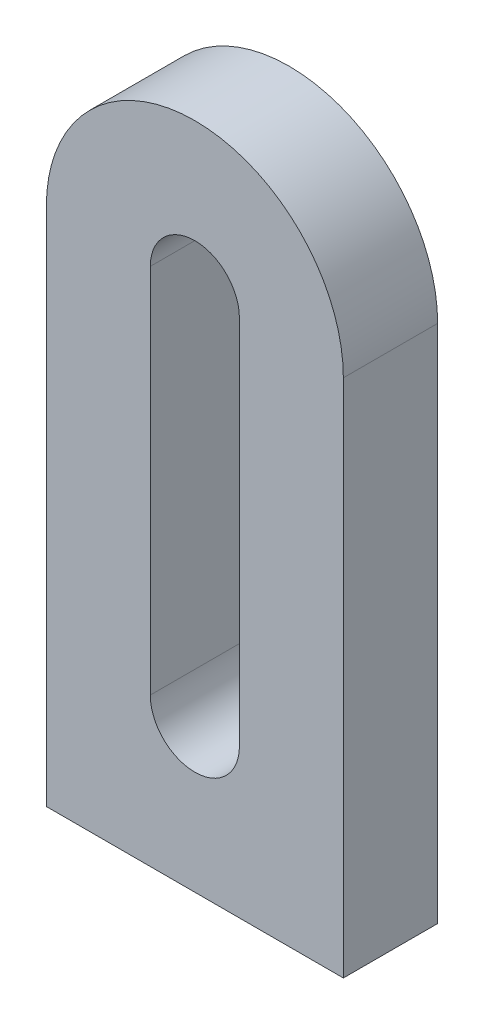
ISO-10303-21;
HEADER;
FILE_DESCRIPTION(('STEP AP214'),'2;1');
FILE_NAME('part.step','',(''),(''),'','','');
FILE_SCHEMA(('AUTOMOTIVE_DESIGN { 1 0 10303 214 1 1 1 1 }'));
ENDSEC;
DATA;
#1=APPLICATION_CONTEXT('core data for automotive mechanical design processes');
#2=APPLICATION_PROTOCOL_DEFINITION('international standard','automotive_design',2000,#1);
#3=PRODUCT_CONTEXT('',#1,'mechanical');
#4=PRODUCT('Part','Part','',(#3));
#5=PRODUCT_RELATED_PRODUCT_CATEGORY('part','',(#4));
#6=PRODUCT_DEFINITION_FORMATION('','',#4);
#7=PRODUCT_DEFINITION_CONTEXT('part definition',#1,'design');
#8=PRODUCT_DEFINITION('design','',#6,#7);
#9=PRODUCT_DEFINITION_SHAPE('','',#8);
#10=(LENGTH_UNIT() NAMED_UNIT(*) SI_UNIT(.MILLI.,.METRE.));
#11=(NAMED_UNIT(*) PLANE_ANGLE_UNIT() SI_UNIT($,.RADIAN.));
#12=(NAMED_UNIT(*) SI_UNIT($,.STERADIAN.) SOLID_ANGLE_UNIT());
#13=UNCERTAINTY_MEASURE_WITH_UNIT(LENGTH_MEASURE(1.E-05),#10,'distance_accuracy_value','');
#14=(GEOMETRIC_REPRESENTATION_CONTEXT(3) GLOBAL_UNCERTAINTY_ASSIGNED_CONTEXT((#13)) GLOBAL_UNIT_ASSIGNED_CONTEXT((#10,
#11,#12)) REPRESENTATION_CONTEXT('',''));
#15=CARTESIAN_POINT('',(0.,0.,0.));
#16=DIRECTION('',(0.,0.,1.));
#17=DIRECTION('',(1.,0.,0.));
#18=AXIS2_PLACEMENT_3D('',#15,#16,#17);
#19=CARTESIAN_POINT('',(0.,35.,6.35));
#20=DIRECTION('',(0.,0.,-1.));
#21=DIRECTION('',(-1.,0.,0.));
#22=AXIS2_PLACEMENT_3D('',#19,#20,#21);
#23=PLANE('',#22);
#24=CARTESIAN_POINT('',(0.,35.,6.35));
#25=DIRECTION('',(0.,0.,1.));
#26=DIRECTION('',(-1.,0.,0.));
#27=AXIS2_PLACEMENT_3D('',#24,#25,#26);
#28=CIRCLE('',#27,10.);
#29=CARTESIAN_POINT('',(10.,35.,6.35));
#30=VERTEX_POINT('',#29);
#31=CARTESIAN_POINT('',(-10.,35.,6.35));
#32=VERTEX_POINT('',#31);
#33=EDGE_CURVE('E142',#30,#32,#28,.T.);
#34=ORIENTED_EDGE('',*,*,#33,.T.);
#35=DIRECTION('',(0.,-1.,0.));
#36=VECTOR('',#35,1.);
#37=CARTESIAN_POINT('',(-10.,35.,6.35));
#38=LINE('',#37,#36);
#39=CARTESIAN_POINT('',(-10.,0.,6.35));
#40=VERTEX_POINT('',#39);
#41=EDGE_CURVE('E145',#32,#40,#38,.T.);
#42=ORIENTED_EDGE('',*,*,#41,.T.);
#43=DIRECTION('',(1.,0.,0.));
#44=VECTOR('',#43,1.);
#45=CARTESIAN_POINT('',(-10.,0.,6.35));
#46=LINE('',#45,#44);
#47=CARTESIAN_POINT('',(10.,0.,6.35));
#48=VERTEX_POINT('',#47);
#49=EDGE_CURVE('E148',#40,#48,#46,.T.);
#50=ORIENTED_EDGE('',*,*,#49,.T.);
#51=DIRECTION('',(0.,1.,0.));
#52=VECTOR('',#51,1.);
#53=CARTESIAN_POINT('',(10.,35.,6.35));
#54=LINE('',#53,#52);
#55=EDGE_CURVE('E150',#48,#30,#54,.T.);
#56=ORIENTED_EDGE('',*,*,#55,.T.);
#57=EDGE_LOOP('',(#34,#42,#50,#56));
#58=FACE_BOUND('',#57,.T.);
#59=CARTESIAN_POINT('',(0.,35.,6.35));
#60=DIRECTION('',(0.,0.,1.));
#61=DIRECTION('',(1.,0.,0.));
#62=AXIS2_PLACEMENT_3D('',#59,#60,#61);
#63=CIRCLE('',#62,3.);
#64=CARTESIAN_POINT('',(3.,35.,6.35));
#65=VERTEX_POINT('',#64);
#66=CARTESIAN_POINT('',(-3.,35.,6.35));
#67=VERTEX_POINT('',#66);
#68=EDGE_CURVE('E106',#65,#67,#63,.T.);
#69=ORIENTED_EDGE('',*,*,#68,.F.);
#70=DIRECTION('',(0.,1.,0.));
#71=VECTOR('',#70,1.);
#72=CARTESIAN_POINT('',(3.,35.,6.35));
#73=LINE('',#72,#71);
#74=CARTESIAN_POINT('',(3.,10.,6.35));
#75=VERTEX_POINT('',#74);
#76=EDGE_CURVE('E128',#75,#65,#73,.T.);
#77=ORIENTED_EDGE('',*,*,#76,.F.);
#78=CARTESIAN_POINT('',(0.,10.,6.35));
#79=DIRECTION('',(0.,0.,1.));
#80=DIRECTION('',(1.,0.,0.));
#81=AXIS2_PLACEMENT_3D('',#78,#79,#80);
#82=CIRCLE('',#81,3.);
#83=CARTESIAN_POINT('',(-2.99999999999999,10.,6.35));
#84=VERTEX_POINT('',#83);
#85=EDGE_CURVE('E126',#84,#75,#82,.T.);
#86=ORIENTED_EDGE('',*,*,#85,.F.);
#87=DIRECTION('',(0.,-1.,0.));
#88=VECTOR('',#87,1.);
#89=CARTESIAN_POINT('',(-3.,35.,6.35));
#90=LINE('',#89,#88);
#91=EDGE_CURVE('E114',#67,#84,#90,.T.);
#92=ORIENTED_EDGE('',*,*,#91,.F.);
#93=EDGE_LOOP('',(#69,#77,#86,#92));
#94=FACE_BOUND('',#93,.T.);
#95=ADVANCED_FACE('F41',(#58,#94),#23,.F.);
#96=CARTESIAN_POINT('',(0.,35.,0.));
#97=DIRECTION('',(0.,0.,-1.));
#98=DIRECTION('',(-1.,0.,0.));
#99=AXIS2_PLACEMENT_3D('',#96,#97,#98);
#100=PLANE('',#99);
#101=CARTESIAN_POINT('',(0.,35.,0.));
#102=DIRECTION('',(0.,0.,1.));
#103=DIRECTION('',(-1.,0.,0.));
#104=AXIS2_PLACEMENT_3D('',#101,#102,#103);
#105=CIRCLE('',#104,10.);
#106=CARTESIAN_POINT('',(10.,35.,0.));
#107=VERTEX_POINT('',#106);
#108=CARTESIAN_POINT('',(-10.,35.,0.));
#109=VERTEX_POINT('',#108);
#110=EDGE_CURVE('E122',#107,#109,#105,.T.);
#111=ORIENTED_EDGE('',*,*,#110,.F.);
#112=DIRECTION('',(0.,1.,0.));
#113=VECTOR('',#112,1.);
#114=CARTESIAN_POINT('',(10.,35.,0.));
#115=LINE('',#114,#113);
#116=CARTESIAN_POINT('',(10.,0.,0.));
#117=VERTEX_POINT('',#116);
#118=EDGE_CURVE('E146',#117,#107,#115,.T.);
#119=ORIENTED_EDGE('',*,*,#118,.F.);
#120=DIRECTION('',(1.,0.,0.));
#121=VECTOR('',#120,1.);
#122=CARTESIAN_POINT('',(-10.,0.,0.));
#123=LINE('',#122,#121);
#124=CARTESIAN_POINT('',(-10.,0.,0.));
#125=VERTEX_POINT('',#124);
#126=EDGE_CURVE('E157',#125,#117,#123,.T.);
#127=ORIENTED_EDGE('',*,*,#126,.F.);
#128=DIRECTION('',(0.,-1.,0.));
#129=VECTOR('',#128,1.);
#130=CARTESIAN_POINT('',(-10.,35.,0.));
#131=LINE('',#130,#129);
#132=EDGE_CURVE('E155',#109,#125,#131,.T.);
#133=ORIENTED_EDGE('',*,*,#132,.F.);
#134=EDGE_LOOP('',(#111,#119,#127,#133));
#135=FACE_BOUND('',#134,.T.);
#136=DIRECTION('',(0.,1.,0.));
#137=VECTOR('',#136,1.);
#138=CARTESIAN_POINT('',(3.,35.,0.));
#139=LINE('',#138,#137);
#140=CARTESIAN_POINT('',(3.,10.,0.));
#141=VERTEX_POINT('',#140);
#142=CARTESIAN_POINT('',(3.,35.,0.));
#143=VERTEX_POINT('',#142);
#144=EDGE_CURVE('E115',#141,#143,#139,.T.);
#145=ORIENTED_EDGE('',*,*,#144,.T.);
#146=CARTESIAN_POINT('',(0.,35.,0.));
#147=DIRECTION('',(0.,0.,1.));
#148=DIRECTION('',(1.,0.,0.));
#149=AXIS2_PLACEMENT_3D('',#146,#147,#148);
#150=CIRCLE('',#149,3.);
#151=CARTESIAN_POINT('',(-3.,35.,0.));
#152=VERTEX_POINT('',#151);
#153=EDGE_CURVE('E64',#143,#152,#150,.T.);
#154=ORIENTED_EDGE('',*,*,#153,.T.);
#155=DIRECTION('',(0.,-1.,0.));
#156=VECTOR('',#155,1.);
#157=CARTESIAN_POINT('',(-3.,35.,0.));
#158=LINE('',#157,#156);
#159=CARTESIAN_POINT('',(-2.99999999999999,10.,0.));
#160=VERTEX_POINT('',#159);
#161=EDGE_CURVE('E121',#152,#160,#158,.T.);
#162=ORIENTED_EDGE('',*,*,#161,.T.);
#163=CARTESIAN_POINT('',(0.,10.,0.));
#164=DIRECTION('',(0.,0.,1.));
#165=DIRECTION('',(1.,0.,0.));
#166=AXIS2_PLACEMENT_3D('',#163,#164,#165);
#167=CIRCLE('',#166,3.);
#168=EDGE_CURVE('E134',#160,#141,#167,.T.);
#169=ORIENTED_EDGE('',*,*,#168,.T.);
#170=EDGE_LOOP('',(#145,#154,#162,#169));
#171=FACE_BOUND('',#170,.T.);
#172=ADVANCED_FACE('F175',(#135,#171),#100,.T.);
#173=CARTESIAN_POINT('',(0.,35.,6.35));
#174=DIRECTION('',(0.,0.,-1.));
#175=DIRECTION('',(-1.,0.,0.));
#176=AXIS2_PLACEMENT_3D('',#173,#174,#175);
#177=CYLINDRICAL_SURFACE('',#176,10.);
#178=ORIENTED_EDGE('',*,*,#110,.T.);
#179=DIRECTION('',(0.,0.,-1.));
#180=VECTOR('',#179,1.);
#181=CARTESIAN_POINT('',(-10.,35.,6.35));
#182=LINE('',#181,#180);
#183=EDGE_CURVE('E11',#32,#109,#182,.T.);
#184=ORIENTED_EDGE('',*,*,#183,.F.);
#185=ORIENTED_EDGE('',*,*,#33,.F.);
#186=DIRECTION('',(0.,0.,-1.));
#187=VECTOR('',#186,1.);
#188=CARTESIAN_POINT('',(10.,35.,6.35));
#189=LINE('',#188,#187);
#190=EDGE_CURVE('E152',#30,#107,#189,.T.);
#191=ORIENTED_EDGE('',*,*,#190,.T.);
#192=EDGE_LOOP('',(#178,#184,#185,#191));
#193=FACE_BOUND('',#192,.T.);
#194=ADVANCED_FACE('F43',(#193),#177,.T.);
#195=CARTESIAN_POINT('',(-10.,35.,6.35));
#196=DIRECTION('',(1.,0.,0.));
#197=DIRECTION('',(0.,0.,-1.));
#198=AXIS2_PLACEMENT_3D('',#195,#196,#197);
#199=PLANE('',#198);
#200=ORIENTED_EDGE('',*,*,#132,.T.);
#201=DIRECTION('',(0.,0.,-1.));
#202=VECTOR('',#201,1.);
#203=CARTESIAN_POINT('',(-10.,0.,6.35));
#204=LINE('',#203,#202);
#205=EDGE_CURVE('E49',#40,#125,#204,.T.);
#206=ORIENTED_EDGE('',*,*,#205,.F.);
#207=ORIENTED_EDGE('',*,*,#41,.F.);
#208=ORIENTED_EDGE('',*,*,#183,.T.);
#209=EDGE_LOOP('',(#200,#206,#207,#208));
#210=FACE_BOUND('',#209,.T.);
#211=ADVANCED_FACE('F185',(#210),#199,.F.);
#212=CARTESIAN_POINT('',(-10.,0.,6.35));
#213=DIRECTION('',(0.,1.,0.));
#214=DIRECTION('',(0.,0.,1.));
#215=AXIS2_PLACEMENT_3D('',#212,#213,#214);
#216=PLANE('',#215);
#217=ORIENTED_EDGE('',*,*,#126,.T.);
#218=DIRECTION('',(0.,0.,-1.));
#219=VECTOR('',#218,1.);
#220=CARTESIAN_POINT('',(10.,0.,6.35));
#221=LINE('',#220,#219);
#222=EDGE_CURVE('E162',#48,#117,#221,.T.);
#223=ORIENTED_EDGE('',*,*,#222,.F.);
#224=ORIENTED_EDGE('',*,*,#49,.F.);
#225=ORIENTED_EDGE('',*,*,#205,.T.);
#226=EDGE_LOOP('',(#217,#223,#224,#225));
#227=FACE_BOUND('',#226,.T.);
#228=ADVANCED_FACE('F169',(#227),#216,.F.);
#229=CARTESIAN_POINT('',(10.,35.,6.35));
#230=DIRECTION('',(-1.,0.,0.));
#231=DIRECTION('',(0.,0.,1.));
#232=AXIS2_PLACEMENT_3D('',#229,#230,#231);
#233=PLANE('',#232);
#234=ORIENTED_EDGE('',*,*,#118,.T.);
#235=ORIENTED_EDGE('',*,*,#190,.F.);
#236=ORIENTED_EDGE('',*,*,#55,.F.);
#237=ORIENTED_EDGE('',*,*,#222,.T.);
#238=EDGE_LOOP('',(#234,#235,#236,#237));
#239=FACE_BOUND('',#238,.T.);
#240=ADVANCED_FACE('F179',(#239),#233,.F.);
#241=CARTESIAN_POINT('',(0.,35.,6.35));
#242=DIRECTION('',(0.,0.,-1.));
#243=DIRECTION('',(-1.,0.,0.));
#244=AXIS2_PLACEMENT_3D('',#241,#242,#243);
#245=CYLINDRICAL_SURFACE('',#244,3.);
#246=ORIENTED_EDGE('',*,*,#153,.F.);
#247=DIRECTION('',(0.,0.,-1.));
#248=VECTOR('',#247,1.);
#249=CARTESIAN_POINT('',(3.,35.,6.35));
#250=LINE('',#249,#248);
#251=EDGE_CURVE('E110',#65,#143,#250,.T.);
#252=ORIENTED_EDGE('',*,*,#251,.F.);
#253=ORIENTED_EDGE('',*,*,#68,.T.);
#254=DIRECTION('',(0.,0.,-1.));
#255=VECTOR('',#254,1.);
#256=CARTESIAN_POINT('',(-3.,35.,6.35));
#257=LINE('',#256,#255);
#258=EDGE_CURVE('E109',#67,#152,#257,.T.);
#259=ORIENTED_EDGE('',*,*,#258,.T.);
#260=EDGE_LOOP('',(#246,#252,#253,#259));
#261=FACE_BOUND('',#260,.T.);
#262=ADVANCED_FACE('F108',(#261),#245,.F.);
#263=CARTESIAN_POINT('',(-3.,35.,6.35));
#264=DIRECTION('',(1.,0.,0.));
#265=DIRECTION('',(0.,1.,0.));
#266=AXIS2_PLACEMENT_3D('',#263,#264,#265);
#267=PLANE('',#266);
#268=ORIENTED_EDGE('',*,*,#161,.F.);
#269=ORIENTED_EDGE('',*,*,#258,.F.);
#270=ORIENTED_EDGE('',*,*,#91,.T.);
#271=DIRECTION('',(0.,0.,-1.));
#272=VECTOR('',#271,1.);
#273=CARTESIAN_POINT('',(-2.99999999999999,10.,6.35));
#274=LINE('',#273,#272);
#275=EDGE_CURVE('E123',#84,#160,#274,.T.);
#276=ORIENTED_EDGE('',*,*,#275,.T.);
#277=EDGE_LOOP('',(#268,#269,#270,#276));
#278=FACE_BOUND('',#277,.T.);
#279=ADVANCED_FACE('F118',(#278),#267,.T.);
#280=CARTESIAN_POINT('',(0.,10.,6.35));
#281=DIRECTION('',(0.,0.,-1.));
#282=DIRECTION('',(-1.,0.,0.));
#283=AXIS2_PLACEMENT_3D('',#280,#281,#282);
#284=CYLINDRICAL_SURFACE('',#283,3.);
#285=ORIENTED_EDGE('',*,*,#168,.F.);
#286=ORIENTED_EDGE('',*,*,#275,.F.);
#287=ORIENTED_EDGE('',*,*,#85,.T.);
#288=DIRECTION('',(0.,0.,-1.));
#289=VECTOR('',#288,1.);
#290=CARTESIAN_POINT('',(3.,10.,6.35));
#291=LINE('',#290,#289);
#292=EDGE_CURVE('E56',#75,#141,#291,.T.);
#293=ORIENTED_EDGE('',*,*,#292,.T.);
#294=EDGE_LOOP('',(#285,#286,#287,#293));
#295=FACE_BOUND('',#294,.T.);
#296=ADVANCED_FACE('F208',(#295),#284,.F.);
#297=CARTESIAN_POINT('',(3.,35.,6.35));
#298=DIRECTION('',(-1.,0.,0.));
#299=DIRECTION('',(0.,-1.,0.));
#300=AXIS2_PLACEMENT_3D('',#297,#298,#299);
#301=PLANE('',#300);
#302=ORIENTED_EDGE('',*,*,#144,.F.);
#303=ORIENTED_EDGE('',*,*,#292,.F.);
#304=ORIENTED_EDGE('',*,*,#76,.T.);
#305=ORIENTED_EDGE('',*,*,#251,.T.);
#306=EDGE_LOOP('',(#302,#303,#304,#305));
#307=FACE_BOUND('',#306,.T.);
#308=ADVANCED_FACE('F212',(#307),#301,.T.);
#309=CLOSED_SHELL('',(#95,#172,#194,#211,#228,#240,#262,#279,#296,#308));
#310=MANIFOLD_SOLID_BREP('B2',#309);
#311=ADVANCED_BREP_SHAPE_REPRESENTATION('',(#18,#310),#14);
#312=SHAPE_DEFINITION_REPRESENTATION(#9,#311);
ENDSEC;
END-ISO-10303-21;
